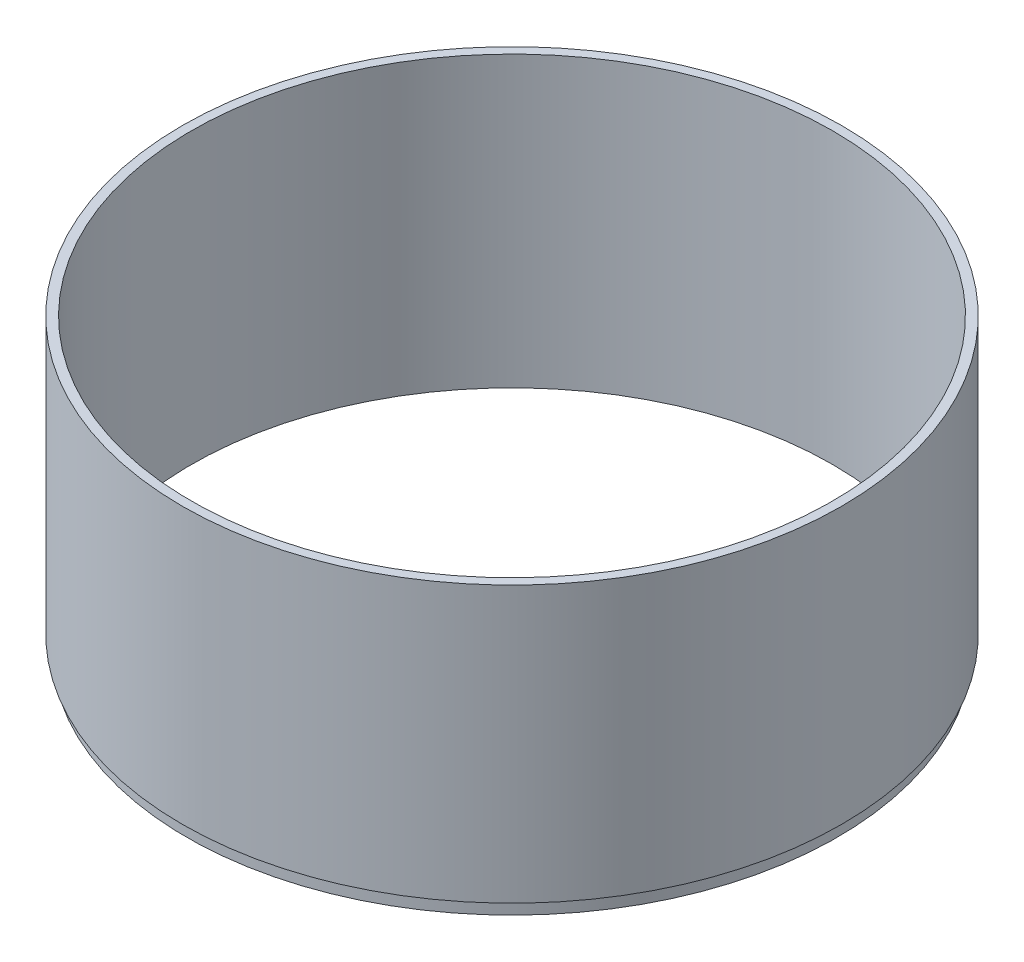
ISO-10303-21;
HEADER;
FILE_DESCRIPTION(('STEP AP214'),'2;1');
FILE_NAME('part.step','',(''),(''),'','','');
FILE_SCHEMA(('AUTOMOTIVE_DESIGN { 1 0 10303 214 1 1 1 1 }'));
ENDSEC;
DATA;
#1=APPLICATION_CONTEXT('core data for automotive mechanical design processes');
#2=APPLICATION_PROTOCOL_DEFINITION('international standard','automotive_design',2000,#1);
#3=PRODUCT_CONTEXT('',#1,'mechanical');
#4=PRODUCT('Part','Part','',(#3));
#5=PRODUCT_RELATED_PRODUCT_CATEGORY('part','',(#4));
#6=PRODUCT_DEFINITION_FORMATION('','',#4);
#7=PRODUCT_DEFINITION_CONTEXT('part definition',#1,'design');
#8=PRODUCT_DEFINITION('design','',#6,#7);
#9=PRODUCT_DEFINITION_SHAPE('','',#8);
#10=(LENGTH_UNIT() NAMED_UNIT(*) SI_UNIT(.MILLI.,.METRE.));
#11=(NAMED_UNIT(*) PLANE_ANGLE_UNIT() SI_UNIT($,.RADIAN.));
#12=(NAMED_UNIT(*) SI_UNIT($,.STERADIAN.) SOLID_ANGLE_UNIT());
#13=UNCERTAINTY_MEASURE_WITH_UNIT(LENGTH_MEASURE(1.E-05),#10,'distance_accuracy_value','');
#14=(GEOMETRIC_REPRESENTATION_CONTEXT(3) GLOBAL_UNCERTAINTY_ASSIGNED_CONTEXT((#13)) GLOBAL_UNIT_ASSIGNED_CONTEXT((#10,
#11,#12)) REPRESENTATION_CONTEXT('',''));
#15=CARTESIAN_POINT('',(0.,0.,0.));
#16=DIRECTION('',(0.,0.,1.));
#17=DIRECTION('',(1.,0.,0.));
#18=AXIS2_PLACEMENT_3D('',#15,#16,#17);
#19=CARTESIAN_POINT('',(0.,0.,0.));
#20=DIRECTION('',(0.,-1.,0.));
#21=DIRECTION('',(0.,0.,-1.));
#22=AXIS2_PLACEMENT_3D('',#19,#20,#21);
#23=CYLINDRICAL_SURFACE('',#22,71.);
#24=CARTESIAN_POINT('',(0.,0.,0.));
#25=DIRECTION('',(0.,-1.,0.));
#26=DIRECTION('',(0.,0.,-1.));
#27=AXIS2_PLACEMENT_3D('',#24,#25,#26);
#28=CIRCLE('',#27,71.);
#29=CARTESIAN_POINT('',(0.,0.,-71.));
#30=VERTEX_POINT('',#29);
#31=EDGE_CURVE('E57',#30,#30,#28,.T.);
#32=ORIENTED_EDGE('',*,*,#31,.T.);
#33=EDGE_LOOP('',(#32));
#34=FACE_BOUND('',#33,.T.);
#35=CARTESIAN_POINT('',(0.,64.,0.));
#36=DIRECTION('',(0.,-1.,0.));
#37=DIRECTION('',(0.,0.,-1.));
#38=AXIS2_PLACEMENT_3D('',#35,#36,#37);
#39=CIRCLE('',#38,71.);
#40=CARTESIAN_POINT('',(0.,64.,-71.));
#41=VERTEX_POINT('',#40);
#42=EDGE_CURVE('E10',#41,#41,#39,.T.);
#43=ORIENTED_EDGE('',*,*,#42,.F.);
#44=EDGE_LOOP('',(#43));
#45=FACE_BOUND('',#44,.T.);
#46=ADVANCED_FACE('F35',(#34,#45),#23,.F.);
#47=CARTESIAN_POINT('',(0.,64.,0.));
#48=DIRECTION('',(0.,1.,0.));
#49=DIRECTION('',(0.,0.,1.));
#50=AXIS2_PLACEMENT_3D('',#47,#48,#49);
#51=PLANE('',#50);
#52=ORIENTED_EDGE('',*,*,#42,.T.);
#53=EDGE_LOOP('',(#52));
#54=FACE_BOUND('',#53,.T.);
#55=CARTESIAN_POINT('',(0.,64.,0.));
#56=DIRECTION('',(0.,-1.,0.));
#57=DIRECTION('',(0.,0.,-1.));
#58=AXIS2_PLACEMENT_3D('',#55,#56,#57);
#59=CIRCLE('',#58,73.);
#60=CARTESIAN_POINT('',(0.,64.,-73.));
#61=VERTEX_POINT('',#60);
#62=EDGE_CURVE('E41',#61,#61,#59,.T.);
#63=ORIENTED_EDGE('',*,*,#62,.F.);
#64=EDGE_LOOP('',(#63));
#65=FACE_BOUND('',#64,.T.);
#66=ADVANCED_FACE('F75',(#54,#65),#51,.T.);
#67=CARTESIAN_POINT('',(0.,0.,0.));
#68=DIRECTION('',(0.,-1.,0.));
#69=DIRECTION('',(0.,0.,-1.));
#70=AXIS2_PLACEMENT_3D('',#67,#68,#69);
#71=CYLINDRICAL_SURFACE('',#70,73.);
#72=ORIENTED_EDGE('',*,*,#62,.T.);
#73=EDGE_LOOP('',(#72));
#74=FACE_BOUND('',#73,.T.);
#75=CARTESIAN_POINT('',(0.,2.99999999999999,0.));
#76=DIRECTION('',(0.,-1.,0.));
#77=DIRECTION('',(0.,0.,-1.));
#78=AXIS2_PLACEMENT_3D('',#75,#76,#77);
#79=CIRCLE('',#78,73.);
#80=CARTESIAN_POINT('',(0.,2.99999999999999,-73.));
#81=VERTEX_POINT('',#80);
#82=EDGE_CURVE('E45',#81,#81,#79,.T.);
#83=ORIENTED_EDGE('',*,*,#82,.F.);
#84=EDGE_LOOP('',(#83));
#85=FACE_BOUND('',#84,.T.);
#86=ADVANCED_FACE('F79',(#74,#85),#71,.T.);
#87=CARTESIAN_POINT('',(0.,2.99999999999999,0.));
#88=DIRECTION('',(0.,-1.,0.));
#89=DIRECTION('',(0.,0.,-1.));
#90=AXIS2_PLACEMENT_3D('',#87,#88,#89);
#91=PLANE('',#90);
#92=ORIENTED_EDGE('',*,*,#82,.T.);
#93=EDGE_LOOP('',(#92));
#94=FACE_BOUND('',#93,.T.);
#95=CARTESIAN_POINT('',(0.,2.99999999999999,0.));
#96=DIRECTION('',(0.,-1.,0.));
#97=DIRECTION('',(0.,0.,-1.));
#98=AXIS2_PLACEMENT_3D('',#95,#96,#97);
#99=CIRCLE('',#98,72.);
#100=CARTESIAN_POINT('',(0.,2.99999999999999,-72.));
#101=VERTEX_POINT('',#100);
#102=EDGE_CURVE('E49',#101,#101,#99,.T.);
#103=ORIENTED_EDGE('',*,*,#102,.F.);
#104=EDGE_LOOP('',(#103));
#105=FACE_BOUND('',#104,.T.);
#106=ADVANCED_FACE('F71',(#94,#105),#91,.T.);
#107=CARTESIAN_POINT('',(0.,0.,0.));
#108=DIRECTION('',(0.,-1.,0.));
#109=DIRECTION('',(0.,0.,-1.));
#110=AXIS2_PLACEMENT_3D('',#107,#108,#109);
#111=CYLINDRICAL_SURFACE('',#110,72.);
#112=ORIENTED_EDGE('',*,*,#102,.T.);
#113=EDGE_LOOP('',(#112));
#114=FACE_BOUND('',#113,.T.);
#115=CARTESIAN_POINT('',(0.,-6.26039443724126E-13,0.));
#116=DIRECTION('',(0.,-1.,0.));
#117=DIRECTION('',(0.,0.,-1.));
#118=AXIS2_PLACEMENT_3D('',#115,#116,#117);
#119=CIRCLE('',#118,72.);
#120=CARTESIAN_POINT('',(0.,-6.26039443724126E-13,-72.));
#121=VERTEX_POINT('',#120);
#122=EDGE_CURVE('E54',#121,#121,#119,.T.);
#123=ORIENTED_EDGE('',*,*,#122,.F.);
#124=EDGE_LOOP('',(#123));
#125=FACE_BOUND('',#124,.T.);
#126=ADVANCED_FACE('F65',(#114,#125),#111,.T.);
#127=CARTESIAN_POINT('',(0.,-3.13050337470895E-13,0.));
#128=DIRECTION('',(0.,-1.,0.));
#129=DIRECTION('',(0.,0.,-1.));
#130=AXIS2_PLACEMENT_3D('',#127,#128,#129);
#131=PLANE('',#130);
#132=ORIENTED_EDGE('',*,*,#122,.T.);
#133=EDGE_LOOP('',(#132));
#134=FACE_BOUND('',#133,.T.);
#135=ORIENTED_EDGE('',*,*,#31,.F.);
#136=EDGE_LOOP('',(#135));
#137=FACE_BOUND('',#136,.T.);
#138=ADVANCED_FACE('F63',(#134,#137),#131,.T.);
#139=CLOSED_SHELL('',(#46,#66,#86,#106,#126,#138));
#140=MANIFOLD_SOLID_BREP('B2',#139);
#141=ADVANCED_BREP_SHAPE_REPRESENTATION('',(#18,#140),#14);
#142=SHAPE_DEFINITION_REPRESENTATION(#9,#141);
ENDSEC;
END-ISO-10303-21;
